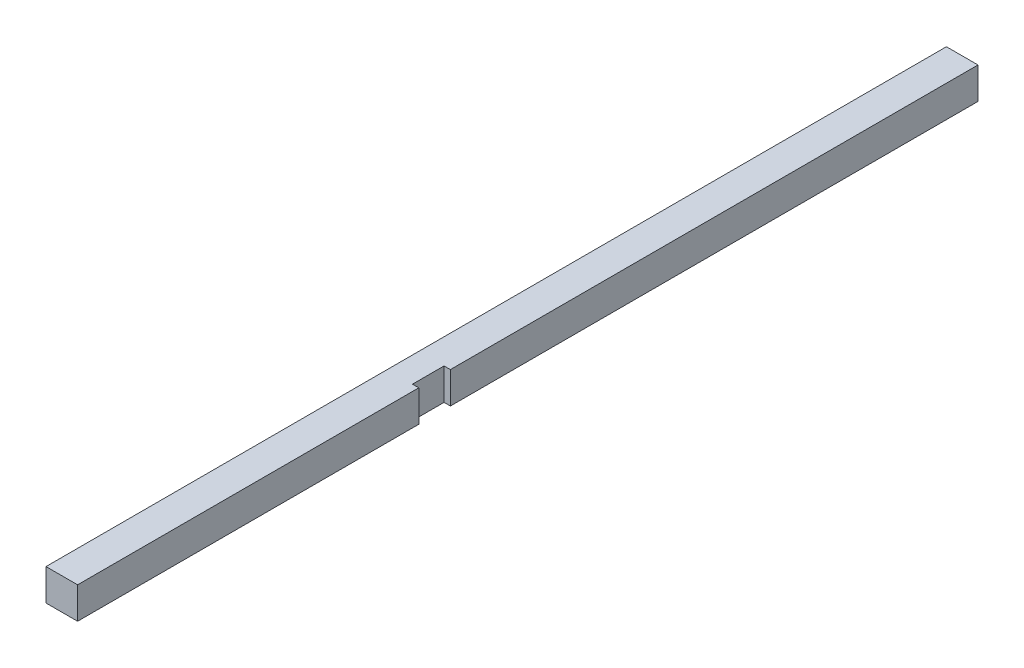
ISO-10303-21;
HEADER;
FILE_DESCRIPTION(('STEP AP214'),'2;1');
FILE_NAME('part.step','',(''),(''),'','','');
FILE_SCHEMA(('AUTOMOTIVE_DESIGN { 1 0 10303 214 1 1 1 1 }'));
ENDSEC;
DATA;
#1=APPLICATION_CONTEXT('core data for automotive mechanical design processes');
#2=APPLICATION_PROTOCOL_DEFINITION('international standard','automotive_design',2000,#1);
#3=PRODUCT_CONTEXT('',#1,'mechanical');
#4=PRODUCT('Part','Part','',(#3));
#5=PRODUCT_RELATED_PRODUCT_CATEGORY('part','',(#4));
#6=PRODUCT_DEFINITION_FORMATION('','',#4);
#7=PRODUCT_DEFINITION_CONTEXT('part definition',#1,'design');
#8=PRODUCT_DEFINITION('design','',#6,#7);
#9=PRODUCT_DEFINITION_SHAPE('','',#8);
#10=(LENGTH_UNIT() NAMED_UNIT(*) SI_UNIT(.MILLI.,.METRE.));
#11=(NAMED_UNIT(*) PLANE_ANGLE_UNIT() SI_UNIT($,.RADIAN.));
#12=(NAMED_UNIT(*) SI_UNIT($,.STERADIAN.) SOLID_ANGLE_UNIT());
#13=UNCERTAINTY_MEASURE_WITH_UNIT(LENGTH_MEASURE(1.E-05),#10,'distance_accuracy_value','');
#14=(GEOMETRIC_REPRESENTATION_CONTEXT(3) GLOBAL_UNCERTAINTY_ASSIGNED_CONTEXT((#13)) GLOBAL_UNIT_ASSIGNED_CONTEXT((#10,
#11,#12)) REPRESENTATION_CONTEXT('',''));
#15=CARTESIAN_POINT('',(0.,0.,0.));
#16=DIRECTION('',(0.,0.,1.));
#17=DIRECTION('',(1.,0.,0.));
#18=AXIS2_PLACEMENT_3D('',#15,#16,#17);
#19=CARTESIAN_POINT('',(10.,0.,285.));
#20=DIRECTION('',(-1.,0.,0.));
#21=DIRECTION('',(0.,0.,1.));
#22=AXIS2_PLACEMENT_3D('',#19,#20,#21);
#23=PLANE('',#22);
#24=DIRECTION('',(0.,0.,-1.));
#25=VECTOR('',#24,1.);
#26=CARTESIAN_POINT('',(10.,0.,285.));
#27=LINE('',#26,#25);
#28=CARTESIAN_POINT('',(10.,0.,285.));
#29=VERTEX_POINT('',#28);
#30=CARTESIAN_POINT('',(10.,0.,177.));
#31=VERTEX_POINT('',#30);
#32=EDGE_CURVE('E41',#29,#31,#27,.T.);
#33=ORIENTED_EDGE('',*,*,#32,.T.);
#34=DIRECTION('',(0.,1.,0.));
#35=VECTOR('',#34,1.);
#36=CARTESIAN_POINT('',(10.,0.,177.));
#37=LINE('',#36,#35);
#38=CARTESIAN_POINT('',(10.,10.,177.));
#39=VERTEX_POINT('',#38);
#40=EDGE_CURVE('E141',#31,#39,#37,.T.);
#41=ORIENTED_EDGE('',*,*,#40,.T.);
#42=DIRECTION('',(0.,0.,-1.));
#43=VECTOR('',#42,1.);
#44=CARTESIAN_POINT('',(10.,10.,285.));
#45=LINE('',#44,#43);
#46=CARTESIAN_POINT('',(10.,10.,285.));
#47=VERTEX_POINT('',#46);
#48=EDGE_CURVE('E126',#47,#39,#45,.T.);
#49=ORIENTED_EDGE('',*,*,#48,.F.);
#50=DIRECTION('',(0.,1.,0.));
#51=VECTOR('',#50,1.);
#52=CARTESIAN_POINT('',(10.,0.,285.));
#53=LINE('',#52,#51);
#54=EDGE_CURVE('E143',#29,#47,#53,.T.);
#55=ORIENTED_EDGE('',*,*,#54,.F.);
#56=EDGE_LOOP('',(#33,#41,#49,#55));
#57=FACE_BOUND('',#56,.T.);
#58=ADVANCED_FACE('F33',(#57),#23,.F.);
#59=CARTESIAN_POINT('',(0.,0.,285.));
#60=DIRECTION('',(1.,0.,0.));
#61=DIRECTION('',(0.,0.,-1.));
#62=AXIS2_PLACEMENT_3D('',#59,#60,#61);
#63=PLANE('',#62);
#64=DIRECTION('',(0.,-1.,0.));
#65=VECTOR('',#64,1.);
#66=CARTESIAN_POINT('',(0.,0.,0.));
#67=LINE('',#66,#65);
#68=CARTESIAN_POINT('',(0.,10.,0.));
#69=VERTEX_POINT('',#68);
#70=CARTESIAN_POINT('',(0.,0.,0.));
#71=VERTEX_POINT('',#70);
#72=EDGE_CURVE('E138',#69,#71,#67,.T.);
#73=ORIENTED_EDGE('',*,*,#72,.T.);
#74=DIRECTION('',(0.,0.,-1.));
#75=VECTOR('',#74,1.);
#76=CARTESIAN_POINT('',(0.,0.,285.));
#77=LINE('',#76,#75);
#78=CARTESIAN_POINT('',(0.,0.,285.));
#79=VERTEX_POINT('',#78);
#80=EDGE_CURVE('E11',#79,#71,#77,.T.);
#81=ORIENTED_EDGE('',*,*,#80,.F.);
#82=DIRECTION('',(0.,-1.,0.));
#83=VECTOR('',#82,1.);
#84=CARTESIAN_POINT('',(0.,0.,285.));
#85=LINE('',#84,#83);
#86=CARTESIAN_POINT('',(0.,10.,285.));
#87=VERTEX_POINT('',#86);
#88=EDGE_CURVE('E134',#87,#79,#85,.T.);
#89=ORIENTED_EDGE('',*,*,#88,.F.);
#90=DIRECTION('',(0.,0.,-1.));
#91=VECTOR('',#90,1.);
#92=CARTESIAN_POINT('',(0.,10.,285.));
#93=LINE('',#92,#91);
#94=EDGE_CURVE('E131',#87,#69,#93,.T.);
#95=ORIENTED_EDGE('',*,*,#94,.T.);
#96=EDGE_LOOP('',(#73,#81,#89,#95));
#97=FACE_BOUND('',#96,.T.);
#98=ADVANCED_FACE('F35',(#97),#63,.F.);
#99=CARTESIAN_POINT('',(0.,0.,285.));
#100=DIRECTION('',(0.,1.,0.));
#101=DIRECTION('',(0.,0.,1.));
#102=AXIS2_PLACEMENT_3D('',#99,#100,#101);
#103=PLANE('',#102);
#104=DIRECTION('',(0.,0.,1.));
#105=VECTOR('',#104,1.);
#106=CARTESIAN_POINT('',(8.,0.,177.));
#107=LINE('',#106,#105);
#108=CARTESIAN_POINT('',(8.,0.,167.));
#109=VERTEX_POINT('',#108);
#110=CARTESIAN_POINT('',(8.,0.,177.));
#111=VERTEX_POINT('',#110);
#112=EDGE_CURVE('E111',#109,#111,#107,.T.);
#113=ORIENTED_EDGE('',*,*,#112,.T.);
#114=DIRECTION('',(1.,0.,0.));
#115=VECTOR('',#114,1.);
#116=CARTESIAN_POINT('',(10.,0.,177.));
#117=LINE('',#116,#115);
#118=EDGE_CURVE('E121',#111,#31,#117,.T.);
#119=ORIENTED_EDGE('',*,*,#118,.T.);
#120=ORIENTED_EDGE('',*,*,#32,.F.);
#121=DIRECTION('',(1.,0.,0.));
#122=VECTOR('',#121,1.);
#123=CARTESIAN_POINT('',(0.,0.,285.));
#124=LINE('',#123,#122);
#125=EDGE_CURVE('E84',#79,#29,#124,.T.);
#126=ORIENTED_EDGE('',*,*,#125,.F.);
#127=ORIENTED_EDGE('',*,*,#80,.T.);
#128=DIRECTION('',(1.,0.,0.));
#129=VECTOR('',#128,1.);
#130=CARTESIAN_POINT('',(0.,0.,0.));
#131=LINE('',#130,#129);
#132=CARTESIAN_POINT('',(10.,0.,0.));
#133=VERTEX_POINT('',#132);
#134=EDGE_CURVE('E124',#71,#133,#131,.T.);
#135=ORIENTED_EDGE('',*,*,#134,.T.);
#136=CARTESIAN_POINT('',(10.,0.,167.));
#137=VERTEX_POINT('',#136);
#138=EDGE_CURVE('E118',#137,#133,#27,.T.);
#139=ORIENTED_EDGE('',*,*,#138,.F.);
#140=DIRECTION('',(-1.,0.,0.));
#141=VECTOR('',#140,1.);
#142=CARTESIAN_POINT('',(10.,0.,167.));
#143=LINE('',#142,#141);
#144=EDGE_CURVE('E105',#137,#109,#143,.T.);
#145=ORIENTED_EDGE('',*,*,#144,.T.);
#146=EDGE_LOOP('',(#113,#119,#120,#126,#127,#135,#139,#145));
#147=FACE_BOUND('',#146,.T.);
#148=ADVANCED_FACE('F123',(#147),#103,.F.);
#149=CARTESIAN_POINT('',(10.,10.,167.));
#150=VERTEX_POINT('',#149);
#151=CARTESIAN_POINT('',(10.,10.,0.));
#152=VERTEX_POINT('',#151);
#153=EDGE_CURVE('E120',#150,#152,#45,.T.);
#154=ORIENTED_EDGE('',*,*,#153,.F.);
#155=DIRECTION('',(0.,1.,0.));
#156=VECTOR('',#155,1.);
#157=CARTESIAN_POINT('',(10.,0.,167.));
#158=LINE('',#157,#156);
#159=EDGE_CURVE('E48',#137,#150,#158,.T.);
#160=ORIENTED_EDGE('',*,*,#159,.F.);
#161=ORIENTED_EDGE('',*,*,#138,.T.);
#162=DIRECTION('',(0.,1.,0.));
#163=VECTOR('',#162,1.);
#164=CARTESIAN_POINT('',(10.,0.,0.));
#165=LINE('',#164,#163);
#166=EDGE_CURVE('E135',#133,#152,#165,.T.);
#167=ORIENTED_EDGE('',*,*,#166,.T.);
#168=EDGE_LOOP('',(#154,#160,#161,#167));
#169=FACE_BOUND('',#168,.T.);
#170=ADVANCED_FACE('F116',(#169),#23,.F.);
#171=CARTESIAN_POINT('',(0.,10.,285.));
#172=DIRECTION('',(0.,-1.,0.));
#173=DIRECTION('',(0.,0.,-1.));
#174=AXIS2_PLACEMENT_3D('',#171,#172,#173);
#175=PLANE('',#174);
#176=ORIENTED_EDGE('',*,*,#48,.T.);
#177=DIRECTION('',(1.,0.,0.));
#178=VECTOR('',#177,1.);
#179=CARTESIAN_POINT('',(10.,10.,177.));
#180=LINE('',#179,#178);
#181=CARTESIAN_POINT('',(8.,10.,177.));
#182=VERTEX_POINT('',#181);
#183=EDGE_CURVE('E112',#182,#39,#180,.T.);
#184=ORIENTED_EDGE('',*,*,#183,.F.);
#185=DIRECTION('',(0.,0.,1.));
#186=VECTOR('',#185,1.);
#187=CARTESIAN_POINT('',(8.,10.,177.));
#188=LINE('',#187,#186);
#189=CARTESIAN_POINT('',(8.,10.,167.));
#190=VERTEX_POINT('',#189);
#191=EDGE_CURVE('E153',#190,#182,#188,.T.);
#192=ORIENTED_EDGE('',*,*,#191,.F.);
#193=DIRECTION('',(-1.,0.,0.));
#194=VECTOR('',#193,1.);
#195=CARTESIAN_POINT('',(10.,10.,167.));
#196=LINE('',#195,#194);
#197=EDGE_CURVE('E156',#150,#190,#196,.T.);
#198=ORIENTED_EDGE('',*,*,#197,.F.);
#199=ORIENTED_EDGE('',*,*,#153,.T.);
#200=DIRECTION('',(-1.,0.,0.));
#201=VECTOR('',#200,1.);
#202=CARTESIAN_POINT('',(0.,10.,0.));
#203=LINE('',#202,#201);
#204=EDGE_CURVE('E77',#152,#69,#203,.T.);
#205=ORIENTED_EDGE('',*,*,#204,.T.);
#206=ORIENTED_EDGE('',*,*,#94,.F.);
#207=DIRECTION('',(-1.,0.,0.));
#208=VECTOR('',#207,1.);
#209=CARTESIAN_POINT('',(0.,10.,285.));
#210=LINE('',#209,#208);
#211=EDGE_CURVE('E57',#47,#87,#210,.T.);
#212=ORIENTED_EDGE('',*,*,#211,.F.);
#213=EDGE_LOOP('',(#176,#184,#192,#198,#199,#205,#206,#212));
#214=FACE_BOUND('',#213,.T.);
#215=ADVANCED_FACE('F170',(#214),#175,.F.);
#216=CARTESIAN_POINT('',(0.,0.,285.));
#217=DIRECTION('',(0.,0.,-1.));
#218=DIRECTION('',(-1.,0.,0.));
#219=AXIS2_PLACEMENT_3D('',#216,#217,#218);
#220=PLANE('',#219);
#221=ORIENTED_EDGE('',*,*,#88,.T.);
#222=ORIENTED_EDGE('',*,*,#125,.T.);
#223=ORIENTED_EDGE('',*,*,#54,.T.);
#224=ORIENTED_EDGE('',*,*,#211,.T.);
#225=EDGE_LOOP('',(#221,#222,#223,#224));
#226=FACE_BOUND('',#225,.T.);
#227=ADVANCED_FACE('F175',(#226),#220,.F.);
#228=CARTESIAN_POINT('',(0.,0.,0.));
#229=DIRECTION('',(0.,0.,-1.));
#230=DIRECTION('',(-1.,0.,0.));
#231=AXIS2_PLACEMENT_3D('',#228,#229,#230);
#232=PLANE('',#231);
#233=ORIENTED_EDGE('',*,*,#72,.F.);
#234=ORIENTED_EDGE('',*,*,#204,.F.);
#235=ORIENTED_EDGE('',*,*,#166,.F.);
#236=ORIENTED_EDGE('',*,*,#134,.F.);
#237=EDGE_LOOP('',(#233,#234,#235,#236));
#238=FACE_BOUND('',#237,.T.);
#239=ADVANCED_FACE('F177',(#238),#232,.T.);
#240=CARTESIAN_POINT('',(10.,0.,177.));
#241=DIRECTION('',(0.,0.,1.));
#242=DIRECTION('',(1.,0.,0.));
#243=AXIS2_PLACEMENT_3D('',#240,#241,#242);
#244=PLANE('',#243);
#245=ORIENTED_EDGE('',*,*,#183,.T.);
#246=ORIENTED_EDGE('',*,*,#40,.F.);
#247=ORIENTED_EDGE('',*,*,#118,.F.);
#248=DIRECTION('',(0.,1.,0.));
#249=VECTOR('',#248,1.);
#250=CARTESIAN_POINT('',(8.,0.,177.));
#251=LINE('',#250,#249);
#252=EDGE_CURVE('E148',#111,#182,#251,.T.);
#253=ORIENTED_EDGE('',*,*,#252,.T.);
#254=EDGE_LOOP('',(#245,#246,#247,#253));
#255=FACE_BOUND('',#254,.T.);
#256=ADVANCED_FACE('F166',(#255),#244,.F.);
#257=CARTESIAN_POINT('',(8.,0.,177.));
#258=DIRECTION('',(-1.,0.,0.));
#259=DIRECTION('',(0.,0.,1.));
#260=AXIS2_PLACEMENT_3D('',#257,#258,#259);
#261=PLANE('',#260);
#262=ORIENTED_EDGE('',*,*,#191,.T.);
#263=ORIENTED_EDGE('',*,*,#252,.F.);
#264=ORIENTED_EDGE('',*,*,#112,.F.);
#265=DIRECTION('',(0.,1.,0.));
#266=VECTOR('',#265,1.);
#267=CARTESIAN_POINT('',(8.,0.,167.));
#268=LINE('',#267,#266);
#269=EDGE_CURVE('E107',#109,#190,#268,.T.);
#270=ORIENTED_EDGE('',*,*,#269,.T.);
#271=EDGE_LOOP('',(#262,#263,#264,#270));
#272=FACE_BOUND('',#271,.T.);
#273=ADVANCED_FACE('F162',(#272),#261,.F.);
#274=CARTESIAN_POINT('',(10.,0.,167.));
#275=DIRECTION('',(0.,0.,-1.));
#276=DIRECTION('',(-1.,0.,0.));
#277=AXIS2_PLACEMENT_3D('',#274,#275,#276);
#278=PLANE('',#277);
#279=ORIENTED_EDGE('',*,*,#197,.T.);
#280=ORIENTED_EDGE('',*,*,#269,.F.);
#281=ORIENTED_EDGE('',*,*,#144,.F.);
#282=ORIENTED_EDGE('',*,*,#159,.T.);
#283=EDGE_LOOP('',(#279,#280,#281,#282));
#284=FACE_BOUND('',#283,.T.);
#285=ADVANCED_FACE('F106',(#284),#278,.F.);
#286=CLOSED_SHELL('',(#58,#98,#148,#170,#215,#227,#239,#256,#273,#285));
#287=MANIFOLD_SOLID_BREP('B2',#286);
#288=ADVANCED_BREP_SHAPE_REPRESENTATION('',(#18,#287),#14);
#289=SHAPE_DEFINITION_REPRESENTATION(#9,#288);
ENDSEC;
END-ISO-10303-21;
